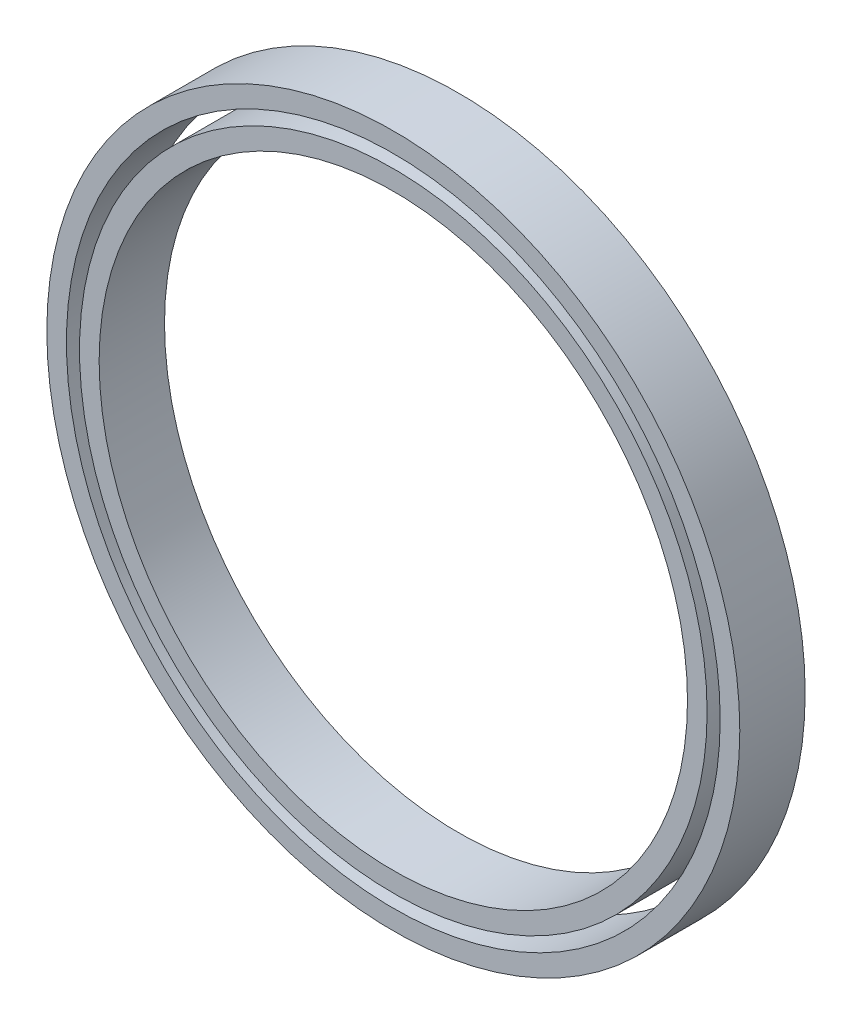
ISO-10303-21;
HEADER;
FILE_DESCRIPTION(('STEP AP214'),'2;1');
FILE_NAME('part.step','',(''),(''),'','','');
FILE_SCHEMA(('AUTOMOTIVE_DESIGN { 1 0 10303 214 1 1 1 1 }'));
ENDSEC;
DATA;
#1=APPLICATION_CONTEXT('core data for automotive mechanical design processes');
#2=APPLICATION_PROTOCOL_DEFINITION('international standard','automotive_design',2000,#1);
#3=PRODUCT_CONTEXT('',#1,'mechanical');
#4=PRODUCT('Part','Part','',(#3));
#5=PRODUCT_RELATED_PRODUCT_CATEGORY('part','',(#4));
#6=PRODUCT_DEFINITION_FORMATION('','',#4);
#7=PRODUCT_DEFINITION_CONTEXT('part definition',#1,'design');
#8=PRODUCT_DEFINITION('design','',#6,#7);
#9=PRODUCT_DEFINITION_SHAPE('','',#8);
#10=(LENGTH_UNIT() NAMED_UNIT(*) SI_UNIT(.MILLI.,.METRE.));
#11=(NAMED_UNIT(*) PLANE_ANGLE_UNIT() SI_UNIT($,.RADIAN.));
#12=(NAMED_UNIT(*) SI_UNIT($,.STERADIAN.) SOLID_ANGLE_UNIT());
#13=UNCERTAINTY_MEASURE_WITH_UNIT(LENGTH_MEASURE(1.E-05),#10,'distance_accuracy_value','');
#14=(GEOMETRIC_REPRESENTATION_CONTEXT(3) GLOBAL_UNCERTAINTY_ASSIGNED_CONTEXT((#13)) GLOBAL_UNIT_ASSIGNED_CONTEXT((#10,
#11,#12)) REPRESENTATION_CONTEXT('',''));
#15=CARTESIAN_POINT('',(0.,0.,0.));
#16=DIRECTION('',(0.,0.,1.));
#17=DIRECTION('',(1.,0.,0.));
#18=AXIS2_PLACEMENT_3D('',#15,#16,#17);
#19=CARTESIAN_POINT('',(0.,0.,10.));
#20=DIRECTION('',(0.,0.,-1.));
#21=DIRECTION('',(-1.,0.,0.));
#22=AXIS2_PLACEMENT_3D('',#19,#20,#21);
#23=CYLINDRICAL_SURFACE('',#22,50.);
#24=CARTESIAN_POINT('',(0.,0.,10.));
#25=DIRECTION('',(0.,0.,1.));
#26=DIRECTION('',(1.,0.,0.));
#27=AXIS2_PLACEMENT_3D('',#24,#25,#26);
#28=CIRCLE('',#27,50.);
#29=CARTESIAN_POINT('',(50.,0.,10.));
#30=VERTEX_POINT('',#29);
#31=EDGE_CURVE('E54',#30,#30,#28,.T.);
#32=ORIENTED_EDGE('',*,*,#31,.T.);
#33=EDGE_LOOP('',(#32));
#34=FACE_BOUND('',#33,.T.);
#35=CARTESIAN_POINT('',(0.,0.,0.));
#36=DIRECTION('',(0.,0.,1.));
#37=DIRECTION('',(1.,0.,0.));
#38=AXIS2_PLACEMENT_3D('',#35,#36,#37);
#39=CIRCLE('',#38,50.);
#40=CARTESIAN_POINT('',(50.,0.,0.));
#41=VERTEX_POINT('',#40);
#42=EDGE_CURVE('E60',#41,#41,#39,.T.);
#43=ORIENTED_EDGE('',*,*,#42,.F.);
#44=EDGE_LOOP('',(#43));
#45=FACE_BOUND('',#44,.T.);
#46=ADVANCED_FACE('F47',(#34,#45),#23,.F.);
#47=CARTESIAN_POINT('',(0.,0.,10.));
#48=DIRECTION('',(0.,0.,-1.));
#49=DIRECTION('',(-1.,0.,0.));
#50=AXIS2_PLACEMENT_3D('',#47,#48,#49);
#51=CYLINDRICAL_SURFACE('',#50,53.);
#52=CARTESIAN_POINT('',(0.,0.,10.));
#53=DIRECTION('',(0.,0.,1.));
#54=DIRECTION('',(1.,0.,0.));
#55=AXIS2_PLACEMENT_3D('',#52,#53,#54);
#56=CIRCLE('',#55,53.);
#57=CARTESIAN_POINT('',(53.,0.,10.));
#58=VERTEX_POINT('',#57);
#59=EDGE_CURVE('E12',#58,#58,#56,.T.);
#60=ORIENTED_EDGE('',*,*,#59,.F.);
#61=EDGE_LOOP('',(#60));
#62=FACE_BOUND('',#61,.T.);
#63=CARTESIAN_POINT('',(0.,0.,0.));
#64=DIRECTION('',(0.,0.,1.));
#65=DIRECTION('',(1.,0.,0.));
#66=AXIS2_PLACEMENT_3D('',#63,#64,#65);
#67=CIRCLE('',#66,53.);
#68=CARTESIAN_POINT('',(53.,0.,0.));
#69=VERTEX_POINT('',#68);
#70=EDGE_CURVE('E50',#69,#69,#67,.T.);
#71=ORIENTED_EDGE('',*,*,#70,.T.);
#72=EDGE_LOOP('',(#71));
#73=FACE_BOUND('',#72,.T.);
#74=ADVANCED_FACE('F67',(#62,#73),#51,.T.);
#75=CARTESIAN_POINT('',(0.,0.,10.));
#76=DIRECTION('',(0.,0.,1.));
#77=DIRECTION('',(1.,0.,0.));
#78=AXIS2_PLACEMENT_3D('',#75,#76,#77);
#79=PLANE('',#78);
#80=ORIENTED_EDGE('',*,*,#31,.F.);
#81=EDGE_LOOP('',(#80));
#82=FACE_BOUND('',#81,.T.);
#83=ORIENTED_EDGE('',*,*,#59,.T.);
#84=EDGE_LOOP('',(#83));
#85=FACE_BOUND('',#84,.T.);
#86=ADVANCED_FACE('F71',(#82,#85),#79,.T.);
#87=CARTESIAN_POINT('',(0.,0.,0.));
#88=DIRECTION('',(0.,0.,1.));
#89=DIRECTION('',(1.,0.,0.));
#90=AXIS2_PLACEMENT_3D('',#87,#88,#89);
#91=PLANE('',#90);
#92=ORIENTED_EDGE('',*,*,#42,.T.);
#93=EDGE_LOOP('',(#92));
#94=FACE_BOUND('',#93,.T.);
#95=ORIENTED_EDGE('',*,*,#70,.F.);
#96=EDGE_LOOP('',(#95));
#97=FACE_BOUND('',#96,.T.);
#98=ADVANCED_FACE('F69',(#94,#97),#91,.F.);
#99=CLOSED_SHELL('',(#46,#74,#86,#98));
#100=MANIFOLD_SOLID_BREP('B2',#99);
#101=CARTESIAN_POINT('',(0.,0.,10.));
#102=DIRECTION('',(0.,0.,-1.));
#103=DIRECTION('',(-1.,0.,0.));
#104=AXIS2_PLACEMENT_3D('',#101,#102,#103);
#105=CYLINDRICAL_SURFACE('',#104,45.);
#106=CARTESIAN_POINT('',(0.,0.,10.));
#107=DIRECTION('',(0.,0.,1.));
#108=DIRECTION('',(1.,0.,0.));
#109=AXIS2_PLACEMENT_3D('',#106,#107,#108);
#110=CIRCLE('',#109,45.);
#111=CARTESIAN_POINT('',(45.,0.,10.));
#112=VERTEX_POINT('',#111);
#113=EDGE_CURVE('E116',#112,#112,#110,.T.);
#114=ORIENTED_EDGE('',*,*,#113,.T.);
#115=EDGE_LOOP('',(#114));
#116=FACE_BOUND('',#115,.T.);
#117=CARTESIAN_POINT('',(0.,0.,0.));
#118=DIRECTION('',(0.,0.,1.));
#119=DIRECTION('',(1.,0.,0.));
#120=AXIS2_PLACEMENT_3D('',#117,#118,#119);
#121=CIRCLE('',#120,45.);
#122=CARTESIAN_POINT('',(45.,0.,0.));
#123=VERTEX_POINT('',#122);
#124=EDGE_CURVE('E122',#123,#123,#121,.T.);
#125=ORIENTED_EDGE('',*,*,#124,.F.);
#126=EDGE_LOOP('',(#125));
#127=FACE_BOUND('',#126,.T.);
#128=ADVANCED_FACE('F109',(#116,#127),#105,.F.);
#129=CARTESIAN_POINT('',(0.,0.,10.));
#130=DIRECTION('',(0.,0.,-1.));
#131=DIRECTION('',(-1.,0.,0.));
#132=AXIS2_PLACEMENT_3D('',#129,#130,#131);
#133=CYLINDRICAL_SURFACE('',#132,48.);
#134=CARTESIAN_POINT('',(0.,0.,10.));
#135=DIRECTION('',(0.,0.,1.));
#136=DIRECTION('',(1.,0.,0.));
#137=AXIS2_PLACEMENT_3D('',#134,#135,#136);
#138=CIRCLE('',#137,48.);
#139=CARTESIAN_POINT('',(48.,0.,10.));
#140=VERTEX_POINT('',#139);
#141=EDGE_CURVE('E46',#140,#140,#138,.T.);
#142=ORIENTED_EDGE('',*,*,#141,.F.);
#143=EDGE_LOOP('',(#142));
#144=FACE_BOUND('',#143,.T.);
#145=CARTESIAN_POINT('',(0.,0.,0.));
#146=DIRECTION('',(0.,0.,1.));
#147=DIRECTION('',(1.,0.,0.));
#148=AXIS2_PLACEMENT_3D('',#145,#146,#147);
#149=CIRCLE('',#148,48.);
#150=CARTESIAN_POINT('',(48.,0.,0.));
#151=VERTEX_POINT('',#150);
#152=EDGE_CURVE('E112',#151,#151,#149,.T.);
#153=ORIENTED_EDGE('',*,*,#152,.T.);
#154=EDGE_LOOP('',(#153));
#155=FACE_BOUND('',#154,.T.);
#156=ADVANCED_FACE('F129',(#144,#155),#133,.T.);
#157=CARTESIAN_POINT('',(0.,0.,10.));
#158=DIRECTION('',(0.,0.,1.));
#159=DIRECTION('',(1.,0.,0.));
#160=AXIS2_PLACEMENT_3D('',#157,#158,#159);
#161=PLANE('',#160);
#162=ORIENTED_EDGE('',*,*,#113,.F.);
#163=EDGE_LOOP('',(#162));
#164=FACE_BOUND('',#163,.T.);
#165=ORIENTED_EDGE('',*,*,#141,.T.);
#166=EDGE_LOOP('',(#165));
#167=FACE_BOUND('',#166,.T.);
#168=ADVANCED_FACE('F133',(#164,#167),#161,.T.);
#169=CARTESIAN_POINT('',(0.,0.,0.));
#170=DIRECTION('',(0.,0.,1.));
#171=DIRECTION('',(1.,0.,0.));
#172=AXIS2_PLACEMENT_3D('',#169,#170,#171);
#173=PLANE('',#172);
#174=ORIENTED_EDGE('',*,*,#124,.T.);
#175=EDGE_LOOP('',(#174));
#176=FACE_BOUND('',#175,.T.);
#177=ORIENTED_EDGE('',*,*,#152,.F.);
#178=EDGE_LOOP('',(#177));
#179=FACE_BOUND('',#178,.T.);
#180=ADVANCED_FACE('F131',(#176,#179),#173,.F.);
#181=CLOSED_SHELL('',(#128,#156,#168,#180));
#182=MANIFOLD_SOLID_BREP('B7',#181);
#183=ADVANCED_BREP_SHAPE_REPRESENTATION('',(#18,#100,#182),#14);
#184=SHAPE_DEFINITION_REPRESENTATION(#9,#183);
ENDSEC;
END-ISO-10303-21;
